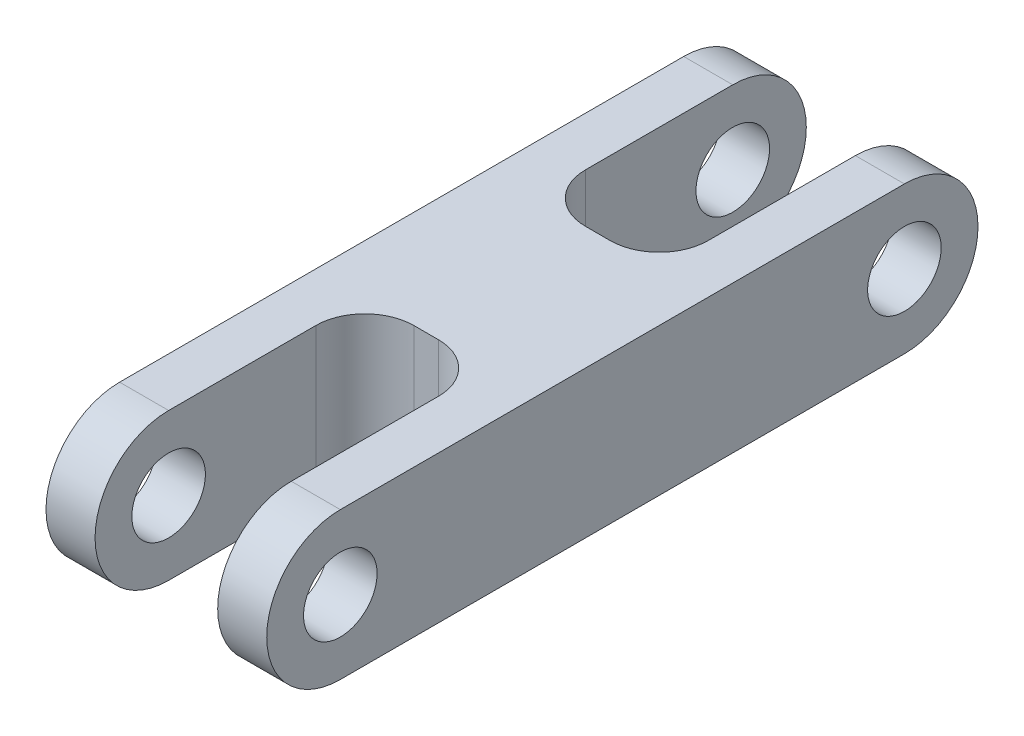
ISO-10303-21;
HEADER;
FILE_DESCRIPTION(('STEP AP214'),'2;1');
FILE_NAME('part.step','',(''),(''),'','','');
FILE_SCHEMA(('AUTOMOTIVE_DESIGN { 1 0 10303 214 1 1 1 1 }'));
ENDSEC;
DATA;
#1=APPLICATION_CONTEXT('core data for automotive mechanical design processes');
#2=APPLICATION_PROTOCOL_DEFINITION('international standard','automotive_design',2000,#1);
#3=PRODUCT_CONTEXT('',#1,'mechanical');
#4=PRODUCT('Part','Part','',(#3));
#5=PRODUCT_RELATED_PRODUCT_CATEGORY('part','',(#4));
#6=PRODUCT_DEFINITION_FORMATION('','',#4);
#7=PRODUCT_DEFINITION_CONTEXT('part definition',#1,'design');
#8=PRODUCT_DEFINITION('design','',#6,#7);
#9=PRODUCT_DEFINITION_SHAPE('','',#8);
#10=(LENGTH_UNIT() NAMED_UNIT(*) SI_UNIT(.MILLI.,.METRE.));
#11=(NAMED_UNIT(*) PLANE_ANGLE_UNIT() SI_UNIT($,.RADIAN.));
#12=(NAMED_UNIT(*) SI_UNIT($,.STERADIAN.) SOLID_ANGLE_UNIT());
#13=UNCERTAINTY_MEASURE_WITH_UNIT(LENGTH_MEASURE(1.E-05),#10,'distance_accuracy_value','');
#14=(GEOMETRIC_REPRESENTATION_CONTEXT(3) GLOBAL_UNCERTAINTY_ASSIGNED_CONTEXT((#13)) GLOBAL_UNIT_ASSIGNED_CONTEXT((#10,
#11,#12)) REPRESENTATION_CONTEXT('',''));
#15=CARTESIAN_POINT('',(0.,0.,0.));
#16=DIRECTION('',(0.,0.,1.));
#17=DIRECTION('',(1.,0.,0.));
#18=AXIS2_PLACEMENT_3D('',#15,#16,#17);
#19=CARTESIAN_POINT('',(2.,0.,11.5));
#20=DIRECTION('',(1.,0.,0.));
#21=DIRECTION('',(0.,0.,-1.));
#22=AXIS2_PLACEMENT_3D('',#19,#20,#21);
#23=PLANE('',#22);
#24=DIRECTION('',(0.,0.,1.));
#25=VECTOR('',#24,1.);
#26=CARTESIAN_POINT('',(2.,3.,11.5));
#27=LINE('',#26,#25);
#28=CARTESIAN_POINT('',(2.,3.,-11.5));
#29=VERTEX_POINT('',#28);
#30=CARTESIAN_POINT('',(2.,3.,-5.5));
#31=VERTEX_POINT('',#30);
#32=EDGE_CURVE('E232',#29,#31,#27,.T.);
#33=ORIENTED_EDGE('',*,*,#32,.T.);
#34=DIRECTION('',(0.,1.,0.));
#35=VECTOR('',#34,1.);
#36=CARTESIAN_POINT('',(2.,0.,-5.5));
#37=LINE('',#36,#35);
#38=CARTESIAN_POINT('',(2.,-3.,-5.5));
#39=VERTEX_POINT('',#38);
#40=EDGE_CURVE('E273',#31,#39,#37,.F.);
#41=ORIENTED_EDGE('',*,*,#40,.T.);
#42=DIRECTION('',(0.,0.,-1.));
#43=VECTOR('',#42,1.);
#44=CARTESIAN_POINT('',(2.,-3.,11.5));
#45=LINE('',#44,#43);
#46=CARTESIAN_POINT('',(2.,-3.,-11.5));
#47=VERTEX_POINT('',#46);
#48=EDGE_CURVE('E223',#39,#47,#45,.T.);
#49=ORIENTED_EDGE('',*,*,#48,.T.);
#50=CARTESIAN_POINT('',(2.,0.,-11.5));
#51=DIRECTION('',(1.,0.,0.));
#52=DIRECTION('',(0.,0.,-1.));
#53=AXIS2_PLACEMENT_3D('',#50,#51,#52);
#54=CIRCLE('',#53,3.);
#55=EDGE_CURVE('E228',#47,#29,#54,.T.);
#56=ORIENTED_EDGE('',*,*,#55,.T.);
#57=EDGE_LOOP('',(#33,#41,#49,#56));
#58=FACE_BOUND('',#57,.T.);
#59=CARTESIAN_POINT('',(2.,0.,-11.5));
#60=DIRECTION('',(1.,0.,0.));
#61=DIRECTION('',(0.,0.,-1.));
#62=AXIS2_PLACEMENT_3D('',#59,#60,#61);
#63=CIRCLE('',#62,1.5);
#64=CARTESIAN_POINT('',(2.,0.,-13.));
#65=VERTEX_POINT('',#64);
#66=EDGE_CURVE('E203',#65,#65,#63,.T.);
#67=ORIENTED_EDGE('',*,*,#66,.F.);
#68=EDGE_LOOP('',(#67));
#69=FACE_BOUND('',#68,.T.);
#70=ADVANCED_FACE('F39',(#58,#69),#23,.T.);
#71=CARTESIAN_POINT('',(2.,-3.,11.5));
#72=VERTEX_POINT('',#71);
#73=CARTESIAN_POINT('',(2.,-3.,5.5));
#74=VERTEX_POINT('',#73);
#75=EDGE_CURVE('E225',#72,#74,#45,.T.);
#76=ORIENTED_EDGE('',*,*,#75,.T.);
#77=DIRECTION('',(0.,-1.,0.));
#78=VECTOR('',#77,1.);
#79=CARTESIAN_POINT('',(2.,0.,5.5));
#80=LINE('',#79,#78);
#81=CARTESIAN_POINT('',(2.,3.,5.5));
#82=VERTEX_POINT('',#81);
#83=EDGE_CURVE('E61',#74,#82,#80,.F.);
#84=ORIENTED_EDGE('',*,*,#83,.T.);
#85=CARTESIAN_POINT('',(2.,3.,11.5));
#86=VERTEX_POINT('',#85);
#87=EDGE_CURVE('E231',#82,#86,#27,.T.);
#88=ORIENTED_EDGE('',*,*,#87,.T.);
#89=CARTESIAN_POINT('',(2.,0.,11.5));
#90=DIRECTION('',(1.,0.,0.));
#91=DIRECTION('',(0.,0.,-1.));
#92=AXIS2_PLACEMENT_3D('',#89,#90,#91);
#93=CIRCLE('',#92,3.);
#94=EDGE_CURVE('E219',#86,#72,#93,.T.);
#95=ORIENTED_EDGE('',*,*,#94,.T.);
#96=EDGE_LOOP('',(#76,#84,#88,#95));
#97=FACE_BOUND('',#96,.T.);
#98=CARTESIAN_POINT('',(2.,0.,11.5));
#99=DIRECTION('',(1.,0.,0.));
#100=DIRECTION('',(0.,0.,-1.));
#101=AXIS2_PLACEMENT_3D('',#98,#99,#100);
#102=CIRCLE('',#101,1.5);
#103=CARTESIAN_POINT('',(2.,0.,10.));
#104=VERTEX_POINT('',#103);
#105=EDGE_CURVE('E211',#104,#104,#102,.T.);
#106=ORIENTED_EDGE('',*,*,#105,.F.);
#107=EDGE_LOOP('',(#106));
#108=FACE_BOUND('',#107,.T.);
#109=ADVANCED_FACE('F408',(#97,#108),#23,.T.);
#110=CARTESIAN_POINT('',(0.,0.,11.5));
#111=DIRECTION('',(1.,0.,0.));
#112=DIRECTION('',(0.,0.,-1.));
#113=AXIS2_PLACEMENT_3D('',#110,#111,#112);
#114=PLANE('',#113);
#115=CARTESIAN_POINT('',(0.,0.,11.5));
#116=DIRECTION('',(1.,0.,0.));
#117=DIRECTION('',(0.,0.,-1.));
#118=AXIS2_PLACEMENT_3D('',#115,#116,#117);
#119=CIRCLE('',#118,3.);
#120=CARTESIAN_POINT('',(0.,3.,11.5));
#121=VERTEX_POINT('',#120);
#122=CARTESIAN_POINT('',(0.,-3.,11.5));
#123=VERTEX_POINT('',#122);
#124=EDGE_CURVE('E215',#121,#123,#119,.T.);
#125=ORIENTED_EDGE('',*,*,#124,.F.);
#126=DIRECTION('',(0.,0.,1.));
#127=VECTOR('',#126,1.);
#128=CARTESIAN_POINT('',(0.,3.,11.5));
#129=LINE('',#128,#127);
#130=CARTESIAN_POINT('',(0.,3.,-11.5));
#131=VERTEX_POINT('',#130);
#132=EDGE_CURVE('E224',#131,#121,#129,.T.);
#133=ORIENTED_EDGE('',*,*,#132,.F.);
#134=CARTESIAN_POINT('',(0.,0.,-11.5));
#135=DIRECTION('',(1.,0.,0.));
#136=DIRECTION('',(0.,0.,-1.));
#137=AXIS2_PLACEMENT_3D('',#134,#135,#136);
#138=CIRCLE('',#137,3.);
#139=CARTESIAN_POINT('',(0.,-3.,-11.5));
#140=VERTEX_POINT('',#139);
#141=EDGE_CURVE('E243',#140,#131,#138,.T.);
#142=ORIENTED_EDGE('',*,*,#141,.F.);
#143=DIRECTION('',(0.,0.,-1.));
#144=VECTOR('',#143,1.);
#145=CARTESIAN_POINT('',(0.,-3.,11.5));
#146=LINE('',#145,#144);
#147=EDGE_CURVE('E240',#123,#140,#146,.T.);
#148=ORIENTED_EDGE('',*,*,#147,.F.);
#149=EDGE_LOOP('',(#125,#133,#142,#148));
#150=FACE_BOUND('',#149,.T.);
#151=CARTESIAN_POINT('',(0.,0.,11.5));
#152=DIRECTION('',(1.,0.,0.));
#153=DIRECTION('',(0.,0.,-1.));
#154=AXIS2_PLACEMENT_3D('',#151,#152,#153);
#155=CIRCLE('',#154,1.5);
#156=CARTESIAN_POINT('',(0.,0.,10.));
#157=VERTEX_POINT('',#156);
#158=EDGE_CURVE('E207',#157,#157,#155,.T.);
#159=ORIENTED_EDGE('',*,*,#158,.T.);
#160=EDGE_LOOP('',(#159));
#161=FACE_BOUND('',#160,.T.);
#162=CARTESIAN_POINT('',(0.,0.,-11.5));
#163=DIRECTION('',(1.,0.,0.));
#164=DIRECTION('',(0.,0.,-1.));
#165=AXIS2_PLACEMENT_3D('',#162,#163,#164);
#166=CIRCLE('',#165,1.5);
#167=CARTESIAN_POINT('',(0.,0.,-13.));
#168=VERTEX_POINT('',#167);
#169=EDGE_CURVE('E202',#168,#168,#166,.T.);
#170=ORIENTED_EDGE('',*,*,#169,.T.);
#171=EDGE_LOOP('',(#170));
#172=FACE_BOUND('',#171,.T.);
#173=ADVANCED_FACE('F374',(#150,#161,#172),#114,.F.);
#174=CARTESIAN_POINT('',(2.,0.,11.5));
#175=DIRECTION('',(-1.,0.,0.));
#176=DIRECTION('',(0.,0.,1.));
#177=AXIS2_PLACEMENT_3D('',#174,#175,#176);
#178=CYLINDRICAL_SURFACE('',#177,3.);
#179=ORIENTED_EDGE('',*,*,#124,.T.);
#180=DIRECTION('',(-1.,0.,0.));
#181=VECTOR('',#180,1.);
#182=CARTESIAN_POINT('',(2.,-3.,11.5));
#183=LINE('',#182,#181);
#184=EDGE_CURVE('E259',#72,#123,#183,.T.);
#185=ORIENTED_EDGE('',*,*,#184,.F.);
#186=ORIENTED_EDGE('',*,*,#94,.F.);
#187=DIRECTION('',(-1.,0.,0.));
#188=VECTOR('',#187,1.);
#189=CARTESIAN_POINT('',(2.,3.,11.5));
#190=LINE('',#189,#188);
#191=EDGE_CURVE('E236',#86,#121,#190,.T.);
#192=ORIENTED_EDGE('',*,*,#191,.T.);
#193=EDGE_LOOP('',(#179,#185,#186,#192));
#194=FACE_BOUND('',#193,.T.);
#195=ADVANCED_FACE('F378',(#194),#178,.T.);
#196=CARTESIAN_POINT('',(2.,-3.,11.5));
#197=DIRECTION('',(0.,1.,0.));
#198=DIRECTION('',(0.,0.,1.));
#199=AXIS2_PLACEMENT_3D('',#196,#197,#198);
#200=PLANE('',#199);
#201=ORIENTED_EDGE('',*,*,#147,.T.);
#202=DIRECTION('',(-1.,0.,0.));
#203=VECTOR('',#202,1.);
#204=CARTESIAN_POINT('',(2.,-3.,-11.5));
#205=LINE('',#204,#203);
#206=EDGE_CURVE('E255',#47,#140,#205,.T.);
#207=ORIENTED_EDGE('',*,*,#206,.F.);
#208=ORIENTED_EDGE('',*,*,#48,.F.);
#209=CARTESIAN_POINT('',(4.,-3.,-5.5));
#210=DIRECTION('',(0.,1.,0.));
#211=DIRECTION('',(0.,0.,1.));
#212=AXIS2_PLACEMENT_3D('',#209,#210,#211);
#213=CIRCLE('',#212,2.);
#214=CARTESIAN_POINT('',(4.,-3.,-3.5));
#215=VERTEX_POINT('',#214);
#216=EDGE_CURVE('E298',#39,#215,#213,.T.);
#217=ORIENTED_EDGE('',*,*,#216,.T.);
#218=DIRECTION('',(-1.,0.,0.));
#219=VECTOR('',#218,1.);
#220=CARTESIAN_POINT('',(7.,-3.,-3.5));
#221=LINE('',#220,#219);
#222=CARTESIAN_POINT('',(5.,-3.,-3.5));
#223=VERTEX_POINT('',#222);
#224=EDGE_CURVE('E180',#223,#215,#221,.T.);
#225=ORIENTED_EDGE('',*,*,#224,.F.);
#226=CARTESIAN_POINT('',(5.,-3.,-5.5));
#227=DIRECTION('',(0.,1.,0.));
#228=DIRECTION('',(0.,0.,1.));
#229=AXIS2_PLACEMENT_3D('',#226,#227,#228);
#230=CIRCLE('',#229,2.);
#231=CARTESIAN_POINT('',(7.,-3.,-5.5));
#232=VERTEX_POINT('',#231);
#233=EDGE_CURVE('E292',#223,#232,#230,.T.);
#234=ORIENTED_EDGE('',*,*,#233,.T.);
#235=DIRECTION('',(0.,0.,-1.));
#236=VECTOR('',#235,1.);
#237=CARTESIAN_POINT('',(7.,-3.,11.5));
#238=LINE('',#237,#236);
#239=CARTESIAN_POINT('',(7.,-3.,-11.5));
#240=VERTEX_POINT('',#239);
#241=EDGE_CURVE('E324',#232,#240,#238,.T.);
#242=ORIENTED_EDGE('',*,*,#241,.T.);
#243=DIRECTION('',(-1.,0.,0.));
#244=VECTOR('',#243,1.);
#245=CARTESIAN_POINT('',(9.,-3.,-11.5));
#246=LINE('',#245,#244);
#247=CARTESIAN_POINT('',(9.,-3.,-11.5));
#248=VERTEX_POINT('',#247);
#249=EDGE_CURVE('E158',#248,#240,#246,.T.);
#250=ORIENTED_EDGE('',*,*,#249,.F.);
#251=DIRECTION('',(0.,0.,-1.));
#252=VECTOR('',#251,1.);
#253=CARTESIAN_POINT('',(9.,-3.,11.5));
#254=LINE('',#253,#252);
#255=CARTESIAN_POINT('',(9.,-3.,11.5));
#256=VERTEX_POINT('',#255);
#257=EDGE_CURVE('E150',#256,#248,#254,.T.);
#258=ORIENTED_EDGE('',*,*,#257,.F.);
#259=DIRECTION('',(-1.,0.,0.));
#260=VECTOR('',#259,1.);
#261=CARTESIAN_POINT('',(9.,-3.,11.5));
#262=LINE('',#261,#260);
#263=CARTESIAN_POINT('',(7.,-3.,11.5));
#264=VERTEX_POINT('',#263);
#265=EDGE_CURVE('E155',#256,#264,#262,.T.);
#266=ORIENTED_EDGE('',*,*,#265,.T.);
#267=CARTESIAN_POINT('',(7.,-3.,5.5));
#268=VERTEX_POINT('',#267);
#269=EDGE_CURVE('E312',#264,#268,#238,.T.);
#270=ORIENTED_EDGE('',*,*,#269,.T.);
#271=CARTESIAN_POINT('',(5.,-3.,5.5));
#272=DIRECTION('',(0.,1.,0.));
#273=DIRECTION('',(0.,0.,1.));
#274=AXIS2_PLACEMENT_3D('',#271,#272,#273);
#275=CIRCLE('',#274,2.);
#276=CARTESIAN_POINT('',(5.,-3.,3.5));
#277=VERTEX_POINT('',#276);
#278=EDGE_CURVE('E301',#268,#277,#275,.T.);
#279=ORIENTED_EDGE('',*,*,#278,.T.);
#280=DIRECTION('',(-1.,0.,0.));
#281=VECTOR('',#280,1.);
#282=CARTESIAN_POINT('',(7.,-3.,3.5));
#283=LINE('',#282,#281);
#284=CARTESIAN_POINT('',(4.,-3.,3.5));
#285=VERTEX_POINT('',#284);
#286=EDGE_CURVE('E185',#277,#285,#283,.T.);
#287=ORIENTED_EDGE('',*,*,#286,.T.);
#288=CARTESIAN_POINT('',(4.,-3.,5.5));
#289=DIRECTION('',(0.,1.,0.));
#290=DIRECTION('',(0.,0.,1.));
#291=AXIS2_PLACEMENT_3D('',#288,#289,#290);
#292=CIRCLE('',#291,2.);
#293=EDGE_CURVE('E48',#285,#74,#292,.T.);
#294=ORIENTED_EDGE('',*,*,#293,.T.);
#295=ORIENTED_EDGE('',*,*,#75,.F.);
#296=ORIENTED_EDGE('',*,*,#184,.T.);
#297=EDGE_LOOP('',(#201,#207,#208,#217,#225,#234,#242,#250,#258,#266,#270,#279,#287,#294,#295,#296));
#298=FACE_BOUND('',#297,.T.);
#299=ADVANCED_FACE('F152',(#298),#200,.F.);
#300=CARTESIAN_POINT('',(2.,0.,-11.5));
#301=DIRECTION('',(-1.,0.,0.));
#302=DIRECTION('',(0.,0.,1.));
#303=AXIS2_PLACEMENT_3D('',#300,#301,#302);
#304=CYLINDRICAL_SURFACE('',#303,3.);
#305=ORIENTED_EDGE('',*,*,#141,.T.);
#306=DIRECTION('',(-1.,0.,0.));
#307=VECTOR('',#306,1.);
#308=CARTESIAN_POINT('',(2.,3.,-11.5));
#309=LINE('',#308,#307);
#310=EDGE_CURVE('E251',#29,#131,#309,.T.);
#311=ORIENTED_EDGE('',*,*,#310,.F.);
#312=ORIENTED_EDGE('',*,*,#55,.F.);
#313=ORIENTED_EDGE('',*,*,#206,.T.);
#314=EDGE_LOOP('',(#305,#311,#312,#313));
#315=FACE_BOUND('',#314,.T.);
#316=ADVANCED_FACE('F368',(#315),#304,.T.);
#317=CARTESIAN_POINT('',(2.,3.,11.5));
#318=DIRECTION('',(0.,-1.,0.));
#319=DIRECTION('',(0.,0.,-1.));
#320=AXIS2_PLACEMENT_3D('',#317,#318,#319);
#321=PLANE('',#320);
#322=ORIENTED_EDGE('',*,*,#132,.T.);
#323=ORIENTED_EDGE('',*,*,#191,.F.);
#324=ORIENTED_EDGE('',*,*,#87,.F.);
#325=CARTESIAN_POINT('',(4.,3.,5.5));
#326=DIRECTION('',(0.,-1.,0.));
#327=DIRECTION('',(0.,0.,-1.));
#328=AXIS2_PLACEMENT_3D('',#325,#326,#327);
#329=CIRCLE('',#328,2.);
#330=CARTESIAN_POINT('',(4.,3.,3.5));
#331=VERTEX_POINT('',#330);
#332=EDGE_CURVE('E11',#82,#331,#329,.T.);
#333=ORIENTED_EDGE('',*,*,#332,.T.);
#334=DIRECTION('',(-1.,0.,0.));
#335=VECTOR('',#334,1.);
#336=CARTESIAN_POINT('',(7.,3.,3.5));
#337=LINE('',#336,#335);
#338=CARTESIAN_POINT('',(5.,3.,3.5));
#339=VERTEX_POINT('',#338);
#340=EDGE_CURVE('E194',#339,#331,#337,.T.);
#341=ORIENTED_EDGE('',*,*,#340,.F.);
#342=CARTESIAN_POINT('',(5.,3.,5.5));
#343=DIRECTION('',(0.,-1.,0.));
#344=DIRECTION('',(0.,0.,-1.));
#345=AXIS2_PLACEMENT_3D('',#342,#343,#344);
#346=CIRCLE('',#345,2.);
#347=CARTESIAN_POINT('',(7.,3.,5.5));
#348=VERTEX_POINT('',#347);
#349=EDGE_CURVE('E304',#339,#348,#346,.T.);
#350=ORIENTED_EDGE('',*,*,#349,.T.);
#351=DIRECTION('',(0.,0.,1.));
#352=VECTOR('',#351,1.);
#353=CARTESIAN_POINT('',(7.,3.,-11.5));
#354=LINE('',#353,#352);
#355=CARTESIAN_POINT('',(7.,3.,11.5));
#356=VERTEX_POINT('',#355);
#357=EDGE_CURVE('E311',#348,#356,#354,.T.);
#358=ORIENTED_EDGE('',*,*,#357,.T.);
#359=DIRECTION('',(-1.,0.,0.));
#360=VECTOR('',#359,1.);
#361=CARTESIAN_POINT('',(9.,3.,11.5));
#362=LINE('',#361,#360);
#363=CARTESIAN_POINT('',(9.,3.,11.5));
#364=VERTEX_POINT('',#363);
#365=EDGE_CURVE('E334',#364,#356,#362,.T.);
#366=ORIENTED_EDGE('',*,*,#365,.F.);
#367=DIRECTION('',(0.,0.,1.));
#368=VECTOR('',#367,1.);
#369=CARTESIAN_POINT('',(9.,3.,-11.5));
#370=LINE('',#369,#368);
#371=CARTESIAN_POINT('',(9.,3.,-11.5));
#372=VERTEX_POINT('',#371);
#373=EDGE_CURVE('E169',#372,#364,#370,.T.);
#374=ORIENTED_EDGE('',*,*,#373,.F.);
#375=DIRECTION('',(-1.,0.,0.));
#376=VECTOR('',#375,1.);
#377=CARTESIAN_POINT('',(9.,3.,-11.5));
#378=LINE('',#377,#376);
#379=CARTESIAN_POINT('',(7.,3.,-11.5));
#380=VERTEX_POINT('',#379);
#381=EDGE_CURVE('E188',#372,#380,#378,.T.);
#382=ORIENTED_EDGE('',*,*,#381,.T.);
#383=CARTESIAN_POINT('',(7.,3.,-5.5));
#384=VERTEX_POINT('',#383);
#385=EDGE_CURVE('E174',#380,#384,#354,.T.);
#386=ORIENTED_EDGE('',*,*,#385,.T.);
#387=CARTESIAN_POINT('',(5.,3.,-5.5));
#388=DIRECTION('',(0.,-1.,0.));
#389=DIRECTION('',(0.,0.,-1.));
#390=AXIS2_PLACEMENT_3D('',#387,#388,#389);
#391=CIRCLE('',#390,2.);
#392=CARTESIAN_POINT('',(5.,3.,-3.5));
#393=VERTEX_POINT('',#392);
#394=EDGE_CURVE('E289',#384,#393,#391,.T.);
#395=ORIENTED_EDGE('',*,*,#394,.T.);
#396=DIRECTION('',(-1.,0.,0.));
#397=VECTOR('',#396,1.);
#398=CARTESIAN_POINT('',(7.,3.,-3.5));
#399=LINE('',#398,#397);
#400=CARTESIAN_POINT('',(4.,3.,-3.5));
#401=VERTEX_POINT('',#400);
#402=EDGE_CURVE('E198',#393,#401,#399,.T.);
#403=ORIENTED_EDGE('',*,*,#402,.T.);
#404=CARTESIAN_POINT('',(4.,3.,-5.5));
#405=DIRECTION('',(0.,-1.,0.));
#406=DIRECTION('',(0.,0.,-1.));
#407=AXIS2_PLACEMENT_3D('',#404,#405,#406);
#408=CIRCLE('',#407,2.);
#409=EDGE_CURVE('E295',#401,#31,#408,.T.);
#410=ORIENTED_EDGE('',*,*,#409,.T.);
#411=ORIENTED_EDGE('',*,*,#32,.F.);
#412=ORIENTED_EDGE('',*,*,#310,.T.);
#413=EDGE_LOOP('',(#322,#323,#324,#333,#341,#350,#358,#366,#374,#382,#386,#395,#403,#410,#411,#412));
#414=FACE_BOUND('',#413,.T.);
#415=ADVANCED_FACE('F341',(#414),#321,.F.);
#416=CARTESIAN_POINT('',(2.,0.,11.5));
#417=DIRECTION('',(-1.,0.,0.));
#418=DIRECTION('',(0.,0.,1.));
#419=AXIS2_PLACEMENT_3D('',#416,#417,#418);
#420=CYLINDRICAL_SURFACE('',#419,1.5);
#421=ORIENTED_EDGE('',*,*,#105,.T.);
#422=EDGE_LOOP('',(#421));
#423=FACE_BOUND('',#422,.T.);
#424=ORIENTED_EDGE('',*,*,#158,.F.);
#425=EDGE_LOOP('',(#424));
#426=FACE_BOUND('',#425,.T.);
#427=ADVANCED_FACE('F415',(#423,#426),#420,.F.);
#428=CARTESIAN_POINT('',(2.,0.,-11.5));
#429=DIRECTION('',(-1.,0.,0.));
#430=DIRECTION('',(0.,0.,1.));
#431=AXIS2_PLACEMENT_3D('',#428,#429,#430);
#432=CYLINDRICAL_SURFACE('',#431,1.5);
#433=ORIENTED_EDGE('',*,*,#66,.T.);
#434=EDGE_LOOP('',(#433));
#435=FACE_BOUND('',#434,.T.);
#436=ORIENTED_EDGE('',*,*,#169,.F.);
#437=EDGE_LOOP('',(#436));
#438=FACE_BOUND('',#437,.T.);
#439=ADVANCED_FACE('F510',(#435,#438),#432,.F.);
#440=CARTESIAN_POINT('',(7.,-3.,-3.5));
#441=DIRECTION('',(0.,0.,1.));
#442=DIRECTION('',(1.,0.,0.));
#443=AXIS2_PLACEMENT_3D('',#440,#441,#442);
#444=PLANE('',#443);
#445=ORIENTED_EDGE('',*,*,#402,.F.);
#446=DIRECTION('',(0.,1.,0.));
#447=VECTOR('',#446,1.);
#448=CARTESIAN_POINT('',(5.,-3.,-3.5));
#449=LINE('',#448,#447);
#450=EDGE_CURVE('E270',#393,#223,#449,.F.);
#451=ORIENTED_EDGE('',*,*,#450,.T.);
#452=ORIENTED_EDGE('',*,*,#224,.T.);
#453=DIRECTION('',(0.,1.,0.));
#454=VECTOR('',#453,1.);
#455=CARTESIAN_POINT('',(4.,-3.,-3.5));
#456=LINE('',#455,#454);
#457=EDGE_CURVE('E266',#215,#401,#456,.T.);
#458=ORIENTED_EDGE('',*,*,#457,.T.);
#459=EDGE_LOOP('',(#445,#451,#452,#458));
#460=FACE_BOUND('',#459,.T.);
#461=ADVANCED_FACE('F353',(#460),#444,.F.);
#462=CARTESIAN_POINT('',(7.,-3.,3.5));
#463=DIRECTION('',(0.,0.,-1.));
#464=DIRECTION('',(-1.,0.,0.));
#465=AXIS2_PLACEMENT_3D('',#462,#463,#464);
#466=PLANE('',#465);
#467=ORIENTED_EDGE('',*,*,#286,.F.);
#468=DIRECTION('',(0.,-1.,0.));
#469=VECTOR('',#468,1.);
#470=CARTESIAN_POINT('',(5.,3.,3.5));
#471=LINE('',#470,#469);
#472=EDGE_CURVE('E284',#277,#339,#471,.F.);
#473=ORIENTED_EDGE('',*,*,#472,.T.);
#474=ORIENTED_EDGE('',*,*,#340,.T.);
#475=DIRECTION('',(0.,-1.,0.));
#476=VECTOR('',#475,1.);
#477=CARTESIAN_POINT('',(4.,-3.,3.5));
#478=LINE('',#477,#476);
#479=EDGE_CURVE('E280',#331,#285,#478,.T.);
#480=ORIENTED_EDGE('',*,*,#479,.T.);
#481=EDGE_LOOP('',(#467,#473,#474,#480));
#482=FACE_BOUND('',#481,.T.);
#483=ADVANCED_FACE('F386',(#482),#466,.F.);
#484=CARTESIAN_POINT('',(7.,0.,11.5));
#485=DIRECTION('',(1.,0.,0.));
#486=DIRECTION('',(0.,0.,-1.));
#487=AXIS2_PLACEMENT_3D('',#484,#485,#486);
#488=PLANE('',#487);
#489=CARTESIAN_POINT('',(7.,0.,-11.5));
#490=DIRECTION('',(1.,0.,0.));
#491=DIRECTION('',(0.,0.,-1.));
#492=AXIS2_PLACEMENT_3D('',#489,#490,#491);
#493=CIRCLE('',#492,1.5);
#494=CARTESIAN_POINT('',(7.,0.,-13.));
#495=VERTEX_POINT('',#494);
#496=EDGE_CURVE('E314',#495,#495,#493,.T.);
#497=ORIENTED_EDGE('',*,*,#496,.T.);
#498=EDGE_LOOP('',(#497));
#499=FACE_BOUND('',#498,.T.);
#500=ORIENTED_EDGE('',*,*,#241,.F.);
#501=DIRECTION('',(0.,1.,0.));
#502=VECTOR('',#501,1.);
#503=CARTESIAN_POINT('',(7.,3.,-5.5));
#504=LINE('',#503,#502);
#505=EDGE_CURVE('E263',#232,#384,#504,.T.);
#506=ORIENTED_EDGE('',*,*,#505,.T.);
#507=ORIENTED_EDGE('',*,*,#385,.F.);
#508=CARTESIAN_POINT('',(7.,0.,-11.5));
#509=DIRECTION('',(1.,0.,0.));
#510=DIRECTION('',(0.,0.,-1.));
#511=AXIS2_PLACEMENT_3D('',#508,#509,#510);
#512=CIRCLE('',#511,3.);
#513=EDGE_CURVE('E309',#240,#380,#512,.T.);
#514=ORIENTED_EDGE('',*,*,#513,.F.);
#515=EDGE_LOOP('',(#500,#506,#507,#514));
#516=FACE_BOUND('',#515,.T.);
#517=ADVANCED_FACE('F345',(#499,#516),#488,.F.);
#518=CARTESIAN_POINT('',(7.,0.,11.5));
#519=DIRECTION('',(1.,0.,0.));
#520=DIRECTION('',(0.,0.,-1.));
#521=AXIS2_PLACEMENT_3D('',#518,#519,#520);
#522=CIRCLE('',#521,1.5);
#523=CARTESIAN_POINT('',(7.,0.,10.));
#524=VERTEX_POINT('',#523);
#525=EDGE_CURVE('E630',#524,#524,#522,.T.);
#526=ORIENTED_EDGE('',*,*,#525,.T.);
#527=EDGE_LOOP('',(#526));
#528=FACE_BOUND('',#527,.T.);
#529=ORIENTED_EDGE('',*,*,#357,.F.);
#530=DIRECTION('',(0.,-1.,0.));
#531=VECTOR('',#530,1.);
#532=CARTESIAN_POINT('',(7.,-3.,5.5));
#533=LINE('',#532,#531);
#534=EDGE_CURVE('E276',#348,#268,#533,.T.);
#535=ORIENTED_EDGE('',*,*,#534,.T.);
#536=ORIENTED_EDGE('',*,*,#269,.F.);
#537=CARTESIAN_POINT('',(7.,0.,11.5));
#538=DIRECTION('',(1.,0.,0.));
#539=DIRECTION('',(0.,0.,-1.));
#540=AXIS2_PLACEMENT_3D('',#537,#538,#539);
#541=CIRCLE('',#540,3.);
#542=EDGE_CURVE('E178',#356,#264,#541,.T.);
#543=ORIENTED_EDGE('',*,*,#542,.F.);
#544=EDGE_LOOP('',(#529,#535,#536,#543));
#545=FACE_BOUND('',#544,.T.);
#546=ADVANCED_FACE('F394',(#528,#545),#488,.F.);
#547=CARTESIAN_POINT('',(9.,0.,11.5));
#548=DIRECTION('',(1.,0.,0.));
#549=DIRECTION('',(0.,0.,-1.));
#550=AXIS2_PLACEMENT_3D('',#547,#548,#549);
#551=PLANE('',#550);
#552=CARTESIAN_POINT('',(9.,0.,-11.5));
#553=DIRECTION('',(1.,0.,0.));
#554=DIRECTION('',(0.,0.,-1.));
#555=AXIS2_PLACEMENT_3D('',#552,#553,#554);
#556=CIRCLE('',#555,1.5);
#557=CARTESIAN_POINT('',(9.,0.,-13.));
#558=VERTEX_POINT('',#557);
#559=EDGE_CURVE('E316',#558,#558,#556,.T.);
#560=ORIENTED_EDGE('',*,*,#559,.F.);
#561=EDGE_LOOP('',(#560));
#562=FACE_BOUND('',#561,.T.);
#563=CARTESIAN_POINT('',(9.,0.,11.5));
#564=DIRECTION('',(1.,0.,0.));
#565=DIRECTION('',(0.,0.,-1.));
#566=AXIS2_PLACEMENT_3D('',#563,#564,#565);
#567=CIRCLE('',#566,3.);
#568=EDGE_CURVE('E163',#364,#256,#567,.T.);
#569=ORIENTED_EDGE('',*,*,#568,.T.);
#570=ORIENTED_EDGE('',*,*,#257,.T.);
#571=CARTESIAN_POINT('',(9.,0.,-11.5));
#572=DIRECTION('',(1.,0.,0.));
#573=DIRECTION('',(0.,0.,-1.));
#574=AXIS2_PLACEMENT_3D('',#571,#572,#573);
#575=CIRCLE('',#574,3.);
#576=EDGE_CURVE('E162',#248,#372,#575,.T.);
#577=ORIENTED_EDGE('',*,*,#576,.T.);
#578=ORIENTED_EDGE('',*,*,#373,.T.);
#579=EDGE_LOOP('',(#569,#570,#577,#578));
#580=FACE_BOUND('',#579,.T.);
#581=CARTESIAN_POINT('',(9.,0.,11.5));
#582=DIRECTION('',(1.,0.,0.));
#583=DIRECTION('',(0.,0.,-1.));
#584=AXIS2_PLACEMENT_3D('',#581,#582,#583);
#585=CIRCLE('',#584,1.5);
#586=CARTESIAN_POINT('',(9.,0.,10.));
#587=VERTEX_POINT('',#586);
#588=EDGE_CURVE('E317',#587,#587,#585,.T.);
#589=ORIENTED_EDGE('',*,*,#588,.F.);
#590=EDGE_LOOP('',(#589));
#591=FACE_BOUND('',#590,.T.);
#592=ADVANCED_FACE('F166',(#562,#580,#591),#551,.T.);
#593=CARTESIAN_POINT('',(9.,0.,11.5));
#594=DIRECTION('',(-1.,0.,0.));
#595=DIRECTION('',(0.,0.,1.));
#596=AXIS2_PLACEMENT_3D('',#593,#594,#595);
#597=CYLINDRICAL_SURFACE('',#596,3.);
#598=ORIENTED_EDGE('',*,*,#542,.T.);
#599=ORIENTED_EDGE('',*,*,#265,.F.);
#600=ORIENTED_EDGE('',*,*,#568,.F.);
#601=ORIENTED_EDGE('',*,*,#365,.T.);
#602=EDGE_LOOP('',(#598,#599,#600,#601));
#603=FACE_BOUND('',#602,.T.);
#604=ADVANCED_FACE('F176',(#603),#597,.T.);
#605=CARTESIAN_POINT('',(9.,0.,-11.5));
#606=DIRECTION('',(-1.,0.,0.));
#607=DIRECTION('',(0.,0.,1.));
#608=AXIS2_PLACEMENT_3D('',#605,#606,#607);
#609=CYLINDRICAL_SURFACE('',#608,3.);
#610=ORIENTED_EDGE('',*,*,#513,.T.);
#611=ORIENTED_EDGE('',*,*,#381,.F.);
#612=ORIENTED_EDGE('',*,*,#576,.F.);
#613=ORIENTED_EDGE('',*,*,#249,.T.);
#614=EDGE_LOOP('',(#610,#611,#612,#613));
#615=FACE_BOUND('',#614,.T.);
#616=ADVANCED_FACE('F468',(#615),#609,.T.);
#617=CARTESIAN_POINT('',(9.,0.,-11.5));
#618=DIRECTION('',(-1.,0.,0.));
#619=DIRECTION('',(0.,0.,1.));
#620=AXIS2_PLACEMENT_3D('',#617,#618,#619);
#621=CYLINDRICAL_SURFACE('',#620,1.5);
#622=ORIENTED_EDGE('',*,*,#559,.T.);
#623=EDGE_LOOP('',(#622));
#624=FACE_BOUND('',#623,.T.);
#625=ORIENTED_EDGE('',*,*,#496,.F.);
#626=EDGE_LOOP('',(#625));
#627=FACE_BOUND('',#626,.T.);
#628=ADVANCED_FACE('F458',(#624,#627),#621,.F.);
#629=CARTESIAN_POINT('',(9.,0.,11.5));
#630=DIRECTION('',(-1.,0.,0.));
#631=DIRECTION('',(0.,0.,1.));
#632=AXIS2_PLACEMENT_3D('',#629,#630,#631);
#633=CYLINDRICAL_SURFACE('',#632,1.5);
#634=ORIENTED_EDGE('',*,*,#588,.T.);
#635=EDGE_LOOP('',(#634));
#636=FACE_BOUND('',#635,.T.);
#637=ORIENTED_EDGE('',*,*,#525,.F.);
#638=EDGE_LOOP('',(#637));
#639=FACE_BOUND('',#638,.T.);
#640=ADVANCED_FACE('F429',(#636,#639),#633,.F.);
#641=CARTESIAN_POINT('',(5.,0.,-5.5));
#642=DIRECTION('',(0.,-1.,0.));
#643=DIRECTION('',(0.,0.,-1.));
#644=AXIS2_PLACEMENT_3D('',#641,#642,#643);
#645=CYLINDRICAL_SURFACE('',#644,2.);
#646=ORIENTED_EDGE('',*,*,#233,.F.);
#647=ORIENTED_EDGE('',*,*,#450,.F.);
#648=ORIENTED_EDGE('',*,*,#394,.F.);
#649=ORIENTED_EDGE('',*,*,#505,.F.);
#650=EDGE_LOOP('',(#646,#647,#648,#649));
#651=FACE_BOUND('',#650,.T.);
#652=ADVANCED_FACE('F349',(#651),#645,.F.);
#653=CARTESIAN_POINT('',(4.,-3.,-5.5));
#654=DIRECTION('',(0.,1.,0.));
#655=DIRECTION('',(0.,0.,1.));
#656=AXIS2_PLACEMENT_3D('',#653,#654,#655);
#657=CYLINDRICAL_SURFACE('',#656,2.);
#658=ORIENTED_EDGE('',*,*,#216,.F.);
#659=ORIENTED_EDGE('',*,*,#40,.F.);
#660=ORIENTED_EDGE('',*,*,#409,.F.);
#661=ORIENTED_EDGE('',*,*,#457,.F.);
#662=EDGE_LOOP('',(#658,#659,#660,#661));
#663=FACE_BOUND('',#662,.T.);
#664=ADVANCED_FACE('F358',(#663),#657,.F.);
#665=CARTESIAN_POINT('',(5.,0.,5.5));
#666=DIRECTION('',(0.,1.,0.));
#667=DIRECTION('',(0.,0.,1.));
#668=AXIS2_PLACEMENT_3D('',#665,#666,#667);
#669=CYLINDRICAL_SURFACE('',#668,2.);
#670=ORIENTED_EDGE('',*,*,#349,.F.);
#671=ORIENTED_EDGE('',*,*,#472,.F.);
#672=ORIENTED_EDGE('',*,*,#278,.F.);
#673=ORIENTED_EDGE('',*,*,#534,.F.);
#674=EDGE_LOOP('',(#670,#671,#672,#673));
#675=FACE_BOUND('',#674,.T.);
#676=ADVANCED_FACE('F391',(#675),#669,.F.);
#677=CARTESIAN_POINT('',(4.,-3.,5.5));
#678=DIRECTION('',(0.,-1.,0.));
#679=DIRECTION('',(0.,0.,-1.));
#680=AXIS2_PLACEMENT_3D('',#677,#678,#679);
#681=CYLINDRICAL_SURFACE('',#680,2.);
#682=ORIENTED_EDGE('',*,*,#332,.F.);
#683=ORIENTED_EDGE('',*,*,#83,.F.);
#684=ORIENTED_EDGE('',*,*,#293,.F.);
#685=ORIENTED_EDGE('',*,*,#479,.F.);
#686=EDGE_LOOP('',(#682,#683,#684,#685));
#687=FACE_BOUND('',#686,.T.);
#688=ADVANCED_FACE('F41',(#687),#681,.F.);
#689=CLOSED_SHELL('',(#70,#109,#173,#195,#299,#316,#415,#427,#439,#461,#483,#517,#546,#592,#604,
#616,#628,#640,#652,#664,#676,#688));
#690=MANIFOLD_SOLID_BREP('B2',#689);
#691=ADVANCED_BREP_SHAPE_REPRESENTATION('',(#18,#690),#14);
#692=SHAPE_DEFINITION_REPRESENTATION(#9,#691);
ENDSEC;
END-ISO-10303-21;
